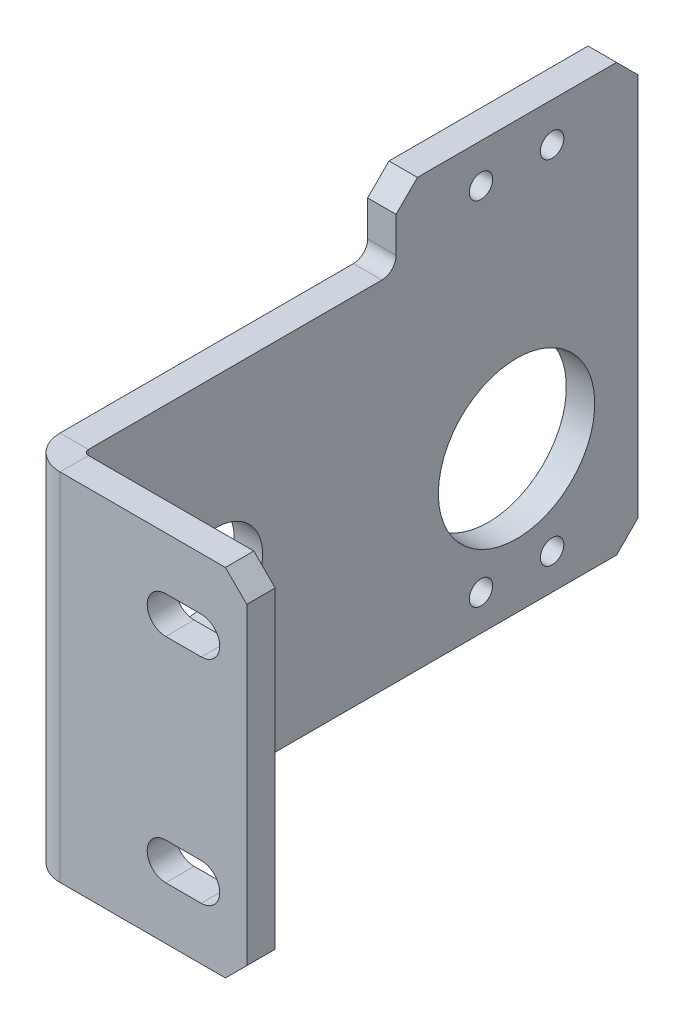
ISO-10303-21;
HEADER;
FILE_DESCRIPTION(('STEP AP214'),'2;1');
FILE_NAME('part.step','',(''),(''),'','','');
FILE_SCHEMA(('AUTOMOTIVE_DESIGN { 1 0 10303 214 1 1 1 1 }'));
ENDSEC;
DATA;
#1=APPLICATION_CONTEXT('core data for automotive mechanical design processes');
#2=APPLICATION_PROTOCOL_DEFINITION('international standard','automotive_design',2000,#1);
#3=PRODUCT_CONTEXT('',#1,'mechanical');
#4=PRODUCT('Part','Part','',(#3));
#5=PRODUCT_RELATED_PRODUCT_CATEGORY('part','',(#4));
#6=PRODUCT_DEFINITION_FORMATION('','',#4);
#7=PRODUCT_DEFINITION_CONTEXT('part definition',#1,'design');
#8=PRODUCT_DEFINITION('design','',#6,#7);
#9=PRODUCT_DEFINITION_SHAPE('','',#8);
#10=(LENGTH_UNIT() NAMED_UNIT(*) SI_UNIT(.MILLI.,.METRE.));
#11=(NAMED_UNIT(*) PLANE_ANGLE_UNIT() SI_UNIT($,.RADIAN.));
#12=(NAMED_UNIT(*) SI_UNIT($,.STERADIAN.) SOLID_ANGLE_UNIT());
#13=UNCERTAINTY_MEASURE_WITH_UNIT(LENGTH_MEASURE(1.E-05),#10,'distance_accuracy_value','');
#14=(GEOMETRIC_REPRESENTATION_CONTEXT(3) GLOBAL_UNCERTAINTY_ASSIGNED_CONTEXT((#13)) GLOBAL_UNIT_ASSIGNED_CONTEXT((#10,
#11,#12)) REPRESENTATION_CONTEXT('',''));
#15=CARTESIAN_POINT('',(0.,0.,0.));
#16=DIRECTION('',(0.,0.,1.));
#17=DIRECTION('',(1.,0.,0.));
#18=AXIS2_PLACEMENT_3D('',#15,#16,#17);
#19=CARTESIAN_POINT('',(4.7366,50.,-4.));
#20=DIRECTION('',(0.,1.,0.));
#21=DIRECTION('',(0.,0.,1.));
#22=AXIS2_PLACEMENT_3D('',#19,#20,#21);
#23=PLANE('',#22);
#24=DIRECTION('',(0.,0.,-1.));
#25=VECTOR('',#24,1.);
#26=CARTESIAN_POINT('',(4.,50.,0.));
#27=LINE('',#26,#25);
#28=CARTESIAN_POINT('',(4.,50.,-4.7366));
#29=VERTEX_POINT('',#28);
#30=CARTESIAN_POINT('',(4.,50.,-46.));
#31=VERTEX_POINT('',#30);
#32=EDGE_CURVE('E281',#29,#31,#27,.T.);
#33=ORIENTED_EDGE('',*,*,#32,.T.);
#34=DIRECTION('',(1.,0.,0.));
#35=VECTOR('',#34,1.);
#36=CARTESIAN_POINT('',(4.7366,50.,-46.));
#37=LINE('',#36,#35);
#38=CARTESIAN_POINT('',(0.,50.,-46.));
#39=VERTEX_POINT('',#38);
#40=EDGE_CURVE('E56',#31,#39,#37,.F.);
#41=ORIENTED_EDGE('',*,*,#40,.T.);
#42=DIRECTION('',(0.,0.,-1.));
#43=VECTOR('',#42,1.);
#44=CARTESIAN_POINT('',(0.,50.,0.));
#45=LINE('',#44,#43);
#46=CARTESIAN_POINT('',(0.,50.,-4.7366));
#47=VERTEX_POINT('',#46);
#48=EDGE_CURVE('E283',#47,#39,#45,.T.);
#49=ORIENTED_EDGE('',*,*,#48,.F.);
#50=DIRECTION('',(1.,0.,0.));
#51=VECTOR('',#50,1.);
#52=CARTESIAN_POINT('',(0.,50.,-4.7366));
#53=LINE('',#52,#51);
#54=EDGE_CURVE('E342',#47,#29,#53,.T.);
#55=ORIENTED_EDGE('',*,*,#54,.T.);
#56=EDGE_LOOP('',(#33,#41,#49,#55));
#57=FACE_BOUND('',#56,.T.);
#58=ADVANCED_FACE('F41',(#57),#23,.T.);
#59=CARTESIAN_POINT('',(0.,50.,-4.7366));
#60=DIRECTION('',(0.,1.,0.));
#61=DIRECTION('',(0.,0.,1.));
#62=AXIS2_PLACEMENT_3D('',#59,#60,#61);
#63=PLANE('',#62);
#64=ORIENTED_EDGE('',*,*,#54,.F.);
#65=CARTESIAN_POINT('',(4.7366,50.,-4.7366));
#66=DIRECTION('',(0.,1.,0.));
#67=DIRECTION('',(0.,0.,1.));
#68=AXIS2_PLACEMENT_3D('',#65,#66,#67);
#69=CIRCLE('',#68,4.7366);
#70=CARTESIAN_POINT('',(4.7366,50.,0.));
#71=VERTEX_POINT('',#70);
#72=EDGE_CURVE('E286',#71,#47,#69,.F.);
#73=ORIENTED_EDGE('',*,*,#72,.F.);
#74=DIRECTION('',(0.,0.,1.));
#75=VECTOR('',#74,1.);
#76=CARTESIAN_POINT('',(4.7366,50.,-4.));
#77=LINE('',#76,#75);
#78=CARTESIAN_POINT('',(4.7366,50.,-4.));
#79=VERTEX_POINT('',#78);
#80=EDGE_CURVE('E339',#79,#71,#77,.T.);
#81=ORIENTED_EDGE('',*,*,#80,.F.);
#82=CARTESIAN_POINT('',(4.7366,50.,-4.7366));
#83=DIRECTION('',(0.,1.,0.));
#84=DIRECTION('',(1.,0.,0.));
#85=AXIS2_PLACEMENT_3D('',#82,#83,#84);
#86=CIRCLE('',#85,0.7366);
#87=EDGE_CURVE('E293',#79,#29,#86,.F.);
#88=ORIENTED_EDGE('',*,*,#87,.T.);
#89=EDGE_LOOP('',(#64,#73,#81,#88));
#90=FACE_BOUND('',#89,.T.);
#91=ADVANCED_FACE('F446',(#90),#63,.T.);
#92=CARTESIAN_POINT('',(4.7366,0.,0.));
#93=DIRECTION('',(0.,-1.,0.));
#94=DIRECTION('',(0.,0.,-1.));
#95=AXIS2_PLACEMENT_3D('',#92,#93,#94);
#96=PLANE('',#95);
#97=DIRECTION('',(0.,0.,-1.));
#98=VECTOR('',#97,1.);
#99=CARTESIAN_POINT('',(4.7366,0.,0.));
#100=LINE('',#99,#98);
#101=CARTESIAN_POINT('',(4.7366,0.,0.));
#102=VERTEX_POINT('',#101);
#103=CARTESIAN_POINT('',(4.7366,0.,-4.));
#104=VERTEX_POINT('',#103);
#105=EDGE_CURVE('E336',#102,#104,#100,.T.);
#106=ORIENTED_EDGE('',*,*,#105,.F.);
#107=CARTESIAN_POINT('',(4.7366,0.,-4.7366));
#108=DIRECTION('',(0.,1.,0.));
#109=DIRECTION('',(0.,0.,1.));
#110=AXIS2_PLACEMENT_3D('',#107,#108,#109);
#111=CIRCLE('',#110,4.7366);
#112=CARTESIAN_POINT('',(0.,0.,-4.7366));
#113=VERTEX_POINT('',#112);
#114=EDGE_CURVE('E302',#102,#113,#111,.F.);
#115=ORIENTED_EDGE('',*,*,#114,.T.);
#116=DIRECTION('',(-1.,0.,0.));
#117=VECTOR('',#116,1.);
#118=CARTESIAN_POINT('',(4.,0.,-4.7366));
#119=LINE('',#118,#117);
#120=CARTESIAN_POINT('',(4.,0.,-4.7366));
#121=VERTEX_POINT('',#120);
#122=EDGE_CURVE('E334',#121,#113,#119,.T.);
#123=ORIENTED_EDGE('',*,*,#122,.F.);
#124=CARTESIAN_POINT('',(4.7366,0.,-4.7366));
#125=DIRECTION('',(0.,1.,0.));
#126=DIRECTION('',(1.,0.,0.));
#127=AXIS2_PLACEMENT_3D('',#124,#125,#126);
#128=CIRCLE('',#127,0.7366);
#129=EDGE_CURVE('E284',#104,#121,#128,.F.);
#130=ORIENTED_EDGE('',*,*,#129,.F.);
#131=EDGE_LOOP('',(#106,#115,#123,#130));
#132=FACE_BOUND('',#131,.T.);
#133=ADVANCED_FACE('F451',(#132),#96,.T.);
#134=CARTESIAN_POINT('',(4.,0.,-4.7366));
#135=DIRECTION('',(0.,-1.,0.));
#136=DIRECTION('',(0.,0.,-1.));
#137=AXIS2_PLACEMENT_3D('',#134,#135,#136);
#138=PLANE('',#137);
#139=DIRECTION('',(1.,0.,0.));
#140=VECTOR('',#139,1.);
#141=CARTESIAN_POINT('',(0.,0.,-4.));
#142=LINE('',#141,#140);
#143=CARTESIAN_POINT('',(28.,0.,-4.));
#144=VERTEX_POINT('',#143);
#145=EDGE_CURVE('E307',#144,#104,#142,.F.);
#146=ORIENTED_EDGE('',*,*,#145,.F.);
#147=DIRECTION('',(0.,0.,1.));
#148=VECTOR('',#147,1.);
#149=CARTESIAN_POINT('',(28.,0.,-4.7366));
#150=LINE('',#149,#148);
#151=CARTESIAN_POINT('',(28.,0.,0.));
#152=VERTEX_POINT('',#151);
#153=EDGE_CURVE('E371',#144,#152,#150,.T.);
#154=ORIENTED_EDGE('',*,*,#153,.T.);
#155=DIRECTION('',(-1.,0.,0.));
#156=VECTOR('',#155,1.);
#157=CARTESIAN_POINT('',(0.,0.,0.));
#158=LINE('',#157,#156);
#159=EDGE_CURVE('E305',#152,#102,#158,.T.);
#160=ORIENTED_EDGE('',*,*,#159,.T.);
#161=ORIENTED_EDGE('',*,*,#105,.T.);
#162=EDGE_LOOP('',(#146,#154,#160,#161));
#163=FACE_BOUND('',#162,.T.);
#164=ADVANCED_FACE('F511',(#163),#138,.T.);
#165=CARTESIAN_POINT('',(4.,50.,0.));
#166=DIRECTION('',(-1.,0.,0.));
#167=DIRECTION('',(0.,0.,1.));
#168=AXIS2_PLACEMENT_3D('',#165,#166,#167);
#169=PLANE('',#168);
#170=CARTESIAN_POINT('',(4.,5.,-59.9414575403353));
#171=DIRECTION('',(-1.,0.,0.));
#172=DIRECTION('',(0.,0.,1.));
#173=AXIS2_PLACEMENT_3D('',#170,#171,#172);
#174=CIRCLE('',#173,1.64999999999999);
#175=CARTESIAN_POINT('',(4.,5.,-58.2914575403353));
#176=VERTEX_POINT('',#175);
#177=EDGE_CURVE('E924',#176,#176,#174,.T.);
#178=ORIENTED_EDGE('',*,*,#177,.T.);
#179=EDGE_LOOP('',(#178));
#180=FACE_BOUND('',#179,.T.);
#181=CARTESIAN_POINT('',(4.,5.,-69.9414575403353));
#182=DIRECTION('',(-1.,0.,0.));
#183=DIRECTION('',(0.,0.,1.));
#184=AXIS2_PLACEMENT_3D('',#181,#182,#183);
#185=CIRCLE('',#184,1.64999999999999);
#186=CARTESIAN_POINT('',(4.,5.,-68.2914575403353));
#187=VERTEX_POINT('',#186);
#188=EDGE_CURVE('E928',#187,#187,#185,.T.);
#189=ORIENTED_EDGE('',*,*,#188,.T.);
#190=EDGE_LOOP('',(#189));
#191=FACE_BOUND('',#190,.T.);
#192=CARTESIAN_POINT('',(4.,54.5,-69.9414575403353));
#193=DIRECTION('',(-1.,0.,0.));
#194=DIRECTION('',(0.,0.,1.));
#195=AXIS2_PLACEMENT_3D('',#192,#193,#194);
#196=CIRCLE('',#195,1.64999999999999);
#197=CARTESIAN_POINT('',(4.,54.5,-68.2914575403353));
#198=VERTEX_POINT('',#197);
#199=EDGE_CURVE('E937',#198,#198,#196,.T.);
#200=ORIENTED_EDGE('',*,*,#199,.T.);
#201=EDGE_LOOP('',(#200));
#202=FACE_BOUND('',#201,.T.);
#203=CARTESIAN_POINT('',(4.,54.5,-59.9414575403353));
#204=DIRECTION('',(-1.,0.,0.));
#205=DIRECTION('',(0.,0.,1.));
#206=AXIS2_PLACEMENT_3D('',#203,#204,#205);
#207=CIRCLE('',#206,1.64999999999999);
#208=CARTESIAN_POINT('',(4.,54.5,-58.2914575403353));
#209=VERTEX_POINT('',#208);
#210=EDGE_CURVE('E943',#209,#209,#207,.T.);
#211=ORIENTED_EDGE('',*,*,#210,.T.);
#212=EDGE_LOOP('',(#211));
#213=FACE_BOUND('',#212,.T.);
#214=CARTESIAN_POINT('',(4.,20.,-64.9414575403353));
#215=DIRECTION('',(-1.,0.,0.));
#216=DIRECTION('',(0.,0.,1.));
#217=AXIS2_PLACEMENT_3D('',#214,#215,#216);
#218=CIRCLE('',#217,11.);
#219=CARTESIAN_POINT('',(4.,20.,-53.9414575403353));
#220=VERTEX_POINT('',#219);
#221=EDGE_CURVE('E271',#220,#220,#218,.T.);
#222=ORIENTED_EDGE('',*,*,#221,.T.);
#223=EDGE_LOOP('',(#222));
#224=FACE_BOUND('',#223,.T.);
#225=CARTESIAN_POINT('',(4.,25.,-22.7366));
#226=DIRECTION('',(-1.,0.,0.));
#227=DIRECTION('',(0.,0.,1.));
#228=AXIS2_PLACEMENT_3D('',#225,#226,#227);
#229=CIRCLE('',#228,6.50000000000001);
#230=CARTESIAN_POINT('',(4.,25.,-16.2366));
#231=VERTEX_POINT('',#230);
#232=EDGE_CURVE('E277',#231,#231,#229,.T.);
#233=ORIENTED_EDGE('',*,*,#232,.T.);
#234=EDGE_LOOP('',(#233));
#235=FACE_BOUND('',#234,.T.);
#236=DIRECTION('',(0.,0.,-1.));
#237=VECTOR('',#236,1.);
#238=CARTESIAN_POINT('',(4.,0.,0.));
#239=LINE('',#238,#237);
#240=CARTESIAN_POINT('',(4.,0.,-79.));
#241=VERTEX_POINT('',#240);
#242=EDGE_CURVE('E280',#121,#241,#239,.T.);
#243=ORIENTED_EDGE('',*,*,#242,.T.);
#244=DIRECTION('',(0.,0.707106781186551,-0.707106781186544));
#245=VECTOR('',#244,1.);
#246=CARTESIAN_POINT('',(4.,0.,-79.));
#247=LINE('',#246,#245);
#248=CARTESIAN_POINT('',(4.,2.99999999999999,-82.));
#249=VERTEX_POINT('',#248);
#250=EDGE_CURVE('E351',#241,#249,#247,.T.);
#251=ORIENTED_EDGE('',*,*,#250,.T.);
#252=DIRECTION('',(0.,-1.,0.));
#253=VECTOR('',#252,1.);
#254=CARTESIAN_POINT('',(4.,50.,-82.));
#255=LINE('',#254,#253);
#256=CARTESIAN_POINT('',(4.,57.,-82.));
#257=VERTEX_POINT('',#256);
#258=EDGE_CURVE('E331',#257,#249,#255,.T.);
#259=ORIENTED_EDGE('',*,*,#258,.F.);
#260=DIRECTION('',(0.,-0.707106781186549,-0.707106781186546));
#261=VECTOR('',#260,1.);
#262=CARTESIAN_POINT('',(4.,60.,-79.));
#263=LINE('',#262,#261);
#264=CARTESIAN_POINT('',(4.,60.,-79.));
#265=VERTEX_POINT('',#264);
#266=EDGE_CURVE('E349',#257,#265,#263,.F.);
#267=ORIENTED_EDGE('',*,*,#266,.T.);
#268=DIRECTION('',(0.,0.,-1.));
#269=VECTOR('',#268,1.);
#270=CARTESIAN_POINT('',(4.,60.,-82.));
#271=LINE('',#270,#269);
#272=CARTESIAN_POINT('',(4.,60.,-51.));
#273=VERTEX_POINT('',#272);
#274=EDGE_CURVE('E260',#273,#265,#271,.T.);
#275=ORIENTED_EDGE('',*,*,#274,.F.);
#276=DIRECTION('',(0.,-0.707106781186549,0.707106781186546));
#277=VECTOR('',#276,1.);
#278=CARTESIAN_POINT('',(4.,60.,-51.));
#279=LINE('',#278,#277);
#280=CARTESIAN_POINT('',(4.,57.,-48.));
#281=VERTEX_POINT('',#280);
#282=EDGE_CURVE('E347',#273,#281,#279,.T.);
#283=ORIENTED_EDGE('',*,*,#282,.T.);
#284=DIRECTION('',(0.,-1.,0.));
#285=VECTOR('',#284,1.);
#286=CARTESIAN_POINT('',(4.,60.,-48.));
#287=LINE('',#286,#285);
#288=CARTESIAN_POINT('',(4.,52.,-48.));
#289=VERTEX_POINT('',#288);
#290=EDGE_CURVE('E263',#281,#289,#287,.T.);
#291=ORIENTED_EDGE('',*,*,#290,.T.);
#292=CARTESIAN_POINT('',(4.,52.,-46.));
#293=DIRECTION('',(-1.,0.,0.));
#294=DIRECTION('',(0.,0.,1.));
#295=AXIS2_PLACEMENT_3D('',#292,#293,#294);
#296=CIRCLE('',#295,2.);
#297=EDGE_CURVE('E49',#289,#31,#296,.T.);
#298=ORIENTED_EDGE('',*,*,#297,.T.);
#299=ORIENTED_EDGE('',*,*,#32,.F.);
#300=DIRECTION('',(0.,-1.,0.));
#301=VECTOR('',#300,1.);
#302=CARTESIAN_POINT('',(4.,50.,-4.7366));
#303=LINE('',#302,#301);
#304=EDGE_CURVE('E296',#29,#121,#303,.T.);
#305=ORIENTED_EDGE('',*,*,#304,.T.);
#306=EDGE_LOOP('',(#243,#251,#259,#267,#275,#283,#291,#298,#299,#305));
#307=FACE_BOUND('',#306,.T.);
#308=ADVANCED_FACE('F421',(#180,#191,#202,#213,#224,#235,#307),#169,.F.);
#309=CARTESIAN_POINT('',(0.,50.,-82.));
#310=DIRECTION('',(0.,0.,-1.));
#311=DIRECTION('',(-1.,0.,0.));
#312=AXIS2_PLACEMENT_3D('',#309,#310,#311);
#313=PLANE('',#312);
#314=ORIENTED_EDGE('',*,*,#258,.T.);
#315=DIRECTION('',(-1.,0.,0.));
#316=VECTOR('',#315,1.);
#317=CARTESIAN_POINT('',(0.,2.99999999999999,-82.));
#318=LINE('',#317,#316);
#319=CARTESIAN_POINT('',(0.,2.99999999999999,-82.));
#320=VERTEX_POINT('',#319);
#321=EDGE_CURVE('E355',#249,#320,#318,.T.);
#322=ORIENTED_EDGE('',*,*,#321,.T.);
#323=DIRECTION('',(0.,-1.,0.));
#324=VECTOR('',#323,1.);
#325=CARTESIAN_POINT('',(0.,50.,-82.));
#326=LINE('',#325,#324);
#327=CARTESIAN_POINT('',(0.,57.,-82.));
#328=VERTEX_POINT('',#327);
#329=EDGE_CURVE('E328',#328,#320,#326,.T.);
#330=ORIENTED_EDGE('',*,*,#329,.F.);
#331=DIRECTION('',(1.,0.,0.));
#332=VECTOR('',#331,1.);
#333=CARTESIAN_POINT('',(0.,57.,-82.));
#334=LINE('',#333,#332);
#335=EDGE_CURVE('E353',#328,#257,#334,.T.);
#336=ORIENTED_EDGE('',*,*,#335,.T.);
#337=EDGE_LOOP('',(#314,#322,#330,#336));
#338=FACE_BOUND('',#337,.T.);
#339=ADVANCED_FACE('F550',(#338),#313,.T.);
#340=CARTESIAN_POINT('',(0.,50.,0.));
#341=DIRECTION('',(-1.,0.,0.));
#342=DIRECTION('',(0.,0.,1.));
#343=AXIS2_PLACEMENT_3D('',#340,#341,#342);
#344=PLANE('',#343);
#345=CARTESIAN_POINT('',(0.,5.,-59.9414575403353));
#346=DIRECTION('',(-1.,0.,0.));
#347=DIRECTION('',(0.,0.,1.));
#348=AXIS2_PLACEMENT_3D('',#345,#346,#347);
#349=CIRCLE('',#348,1.64999999999999);
#350=CARTESIAN_POINT('',(0.,5.,-58.2914575403353));
#351=VERTEX_POINT('',#350);
#352=EDGE_CURVE('E921',#351,#351,#349,.T.);
#353=ORIENTED_EDGE('',*,*,#352,.F.);
#354=EDGE_LOOP('',(#353));
#355=FACE_BOUND('',#354,.T.);
#356=CARTESIAN_POINT('',(0.,5.,-69.9414575403353));
#357=DIRECTION('',(-1.,0.,0.));
#358=DIRECTION('',(0.,0.,1.));
#359=AXIS2_PLACEMENT_3D('',#356,#357,#358);
#360=CIRCLE('',#359,1.64999999999999);
#361=CARTESIAN_POINT('',(0.,5.,-68.2914575403353));
#362=VERTEX_POINT('',#361);
#363=EDGE_CURVE('E925',#362,#362,#360,.T.);
#364=ORIENTED_EDGE('',*,*,#363,.F.);
#365=EDGE_LOOP('',(#364));
#366=FACE_BOUND('',#365,.T.);
#367=CARTESIAN_POINT('',(0.,54.5,-69.9414575403353));
#368=DIRECTION('',(-1.,0.,0.));
#369=DIRECTION('',(0.,0.,1.));
#370=AXIS2_PLACEMENT_3D('',#367,#368,#369);
#371=CIRCLE('',#370,1.64999999999998);
#372=CARTESIAN_POINT('',(0.,54.5,-68.2914575403353));
#373=VERTEX_POINT('',#372);
#374=EDGE_CURVE('E934',#373,#373,#371,.T.);
#375=ORIENTED_EDGE('',*,*,#374,.F.);
#376=EDGE_LOOP('',(#375));
#377=FACE_BOUND('',#376,.T.);
#378=CARTESIAN_POINT('',(0.,54.5,-59.9414575403353));
#379=DIRECTION('',(-1.,0.,0.));
#380=DIRECTION('',(0.,0.,1.));
#381=AXIS2_PLACEMENT_3D('',#378,#379,#380);
#382=CIRCLE('',#381,1.64999999999998);
#383=CARTESIAN_POINT('',(0.,54.5,-58.2914575403353));
#384=VERTEX_POINT('',#383);
#385=EDGE_CURVE('E940',#384,#384,#382,.T.);
#386=ORIENTED_EDGE('',*,*,#385,.F.);
#387=EDGE_LOOP('',(#386));
#388=FACE_BOUND('',#387,.T.);
#389=CARTESIAN_POINT('',(0.,20.,-64.9414575403353));
#390=DIRECTION('',(-1.,0.,0.));
#391=DIRECTION('',(0.,0.,1.));
#392=AXIS2_PLACEMENT_3D('',#389,#390,#391);
#393=CIRCLE('',#392,11.);
#394=CARTESIAN_POINT('',(0.,20.,-53.9414575403353));
#395=VERTEX_POINT('',#394);
#396=EDGE_CURVE('E268',#395,#395,#393,.T.);
#397=ORIENTED_EDGE('',*,*,#396,.F.);
#398=EDGE_LOOP('',(#397));
#399=FACE_BOUND('',#398,.T.);
#400=CARTESIAN_POINT('',(0.,25.,-22.7366));
#401=DIRECTION('',(-1.,0.,0.));
#402=DIRECTION('',(0.,0.,1.));
#403=AXIS2_PLACEMENT_3D('',#400,#401,#402);
#404=CIRCLE('',#403,6.50000000000001);
#405=CARTESIAN_POINT('',(0.,25.,-16.2366));
#406=VERTEX_POINT('',#405);
#407=EDGE_CURVE('E274',#406,#406,#404,.T.);
#408=ORIENTED_EDGE('',*,*,#407,.F.);
#409=EDGE_LOOP('',(#408));
#410=FACE_BOUND('',#409,.T.);
#411=ORIENTED_EDGE('',*,*,#329,.T.);
#412=DIRECTION('',(0.,-0.707106781186551,0.707106781186544));
#413=VECTOR('',#412,1.);
#414=CARTESIAN_POINT('',(0.,-14.4999999999998,-64.5000000000004));
#415=LINE('',#414,#413);
#416=CARTESIAN_POINT('',(0.,0.,-79.));
#417=VERTEX_POINT('',#416);
#418=EDGE_CURVE('E361',#320,#417,#415,.T.);
#419=ORIENTED_EDGE('',*,*,#418,.T.);
#420=DIRECTION('',(0.,0.,-1.));
#421=VECTOR('',#420,1.);
#422=CARTESIAN_POINT('',(0.,0.,0.));
#423=LINE('',#422,#421);
#424=EDGE_CURVE('E299',#113,#417,#423,.T.);
#425=ORIENTED_EDGE('',*,*,#424,.F.);
#426=DIRECTION('',(0.,-1.,0.));
#427=VECTOR('',#426,1.);
#428=CARTESIAN_POINT('',(0.,50.,-4.7366));
#429=LINE('',#428,#427);
#430=EDGE_CURVE('E325',#47,#113,#429,.T.);
#431=ORIENTED_EDGE('',*,*,#430,.F.);
#432=ORIENTED_EDGE('',*,*,#48,.T.);
#433=CARTESIAN_POINT('',(0.,52.,-46.));
#434=DIRECTION('',(-1.,0.,0.));
#435=DIRECTION('',(0.,0.,1.));
#436=AXIS2_PLACEMENT_3D('',#433,#434,#435);
#437=CIRCLE('',#436,2.);
#438=CARTESIAN_POINT('',(0.,52.,-48.));
#439=VERTEX_POINT('',#438);
#440=EDGE_CURVE('E11',#39,#439,#437,.F.);
#441=ORIENTED_EDGE('',*,*,#440,.T.);
#442=DIRECTION('',(0.,-1.,0.));
#443=VECTOR('',#442,1.);
#444=CARTESIAN_POINT('',(0.,60.,-48.));
#445=LINE('',#444,#443);
#446=CARTESIAN_POINT('',(0.,57.,-48.));
#447=VERTEX_POINT('',#446);
#448=EDGE_CURVE('E265',#447,#439,#445,.T.);
#449=ORIENTED_EDGE('',*,*,#448,.F.);
#450=DIRECTION('',(0.,0.707106781186549,-0.707106781186546));
#451=VECTOR('',#450,1.);
#452=CARTESIAN_POINT('',(0.,29.5,-20.5000000000001));
#453=LINE('',#452,#451);
#454=CARTESIAN_POINT('',(0.,60.,-51.));
#455=VERTEX_POINT('',#454);
#456=EDGE_CURVE('E357',#447,#455,#453,.T.);
#457=ORIENTED_EDGE('',*,*,#456,.T.);
#458=DIRECTION('',(0.,0.,1.));
#459=VECTOR('',#458,1.);
#460=CARTESIAN_POINT('',(0.,60.,-82.));
#461=LINE('',#460,#459);
#462=CARTESIAN_POINT('',(0.,60.,-79.));
#463=VERTEX_POINT('',#462);
#464=EDGE_CURVE('E251',#463,#455,#461,.T.);
#465=ORIENTED_EDGE('',*,*,#464,.F.);
#466=DIRECTION('',(0.,0.707106781186549,0.707106781186546));
#467=VECTOR('',#466,1.);
#468=CARTESIAN_POINT('',(0.,94.5,-44.5000000000002));
#469=LINE('',#468,#467);
#470=EDGE_CURVE('E359',#463,#328,#469,.F.);
#471=ORIENTED_EDGE('',*,*,#470,.T.);
#472=EDGE_LOOP('',(#411,#419,#425,#431,#432,#441,#449,#457,#465,#471));
#473=FACE_BOUND('',#472,.T.);
#474=ADVANCED_FACE('F432',(#355,#366,#377,#388,#399,#410,#473),#344,.T.);
#475=CARTESIAN_POINT('',(4.7366,50.,-4.7366));
#476=DIRECTION('',(0.,-1.,0.));
#477=DIRECTION('',(0.,0.,-1.));
#478=AXIS2_PLACEMENT_3D('',#475,#476,#477);
#479=CYLINDRICAL_SURFACE('',#478,4.7366);
#480=ORIENTED_EDGE('',*,*,#114,.F.);
#481=DIRECTION('',(0.,-1.,0.));
#482=VECTOR('',#481,1.);
#483=CARTESIAN_POINT('',(4.7366,50.,0.));
#484=LINE('',#483,#482);
#485=EDGE_CURVE('E322',#71,#102,#484,.T.);
#486=ORIENTED_EDGE('',*,*,#485,.F.);
#487=ORIENTED_EDGE('',*,*,#72,.T.);
#488=ORIENTED_EDGE('',*,*,#430,.T.);
#489=EDGE_LOOP('',(#480,#486,#487,#488));
#490=FACE_BOUND('',#489,.T.);
#491=ADVANCED_FACE('F527',(#490),#479,.T.);
#492=CARTESIAN_POINT('',(0.,50.,0.));
#493=DIRECTION('',(0.,0.,1.));
#494=DIRECTION('',(1.,0.,0.));
#495=AXIS2_PLACEMENT_3D('',#492,#493,#494);
#496=PLANE('',#495);
#497=CARTESIAN_POINT('',(19.6,10.,0.));
#498=DIRECTION('',(0.,0.,1.));
#499=DIRECTION('',(1.,0.,0.));
#500=AXIS2_PLACEMENT_3D('',#497,#498,#499);
#501=CIRCLE('',#500,2.6);
#502=CARTESIAN_POINT('',(19.6,12.6,0.));
#503=VERTEX_POINT('',#502);
#504=CARTESIAN_POINT('',(19.6,7.4,0.));
#505=VERTEX_POINT('',#504);
#506=EDGE_CURVE('E223',#503,#505,#501,.T.);
#507=ORIENTED_EDGE('',*,*,#506,.F.);
#508=DIRECTION('',(-1.,0.,0.));
#509=VECTOR('',#508,1.);
#510=CARTESIAN_POINT('',(19.6,12.6,0.));
#511=LINE('',#510,#509);
#512=CARTESIAN_POINT('',(24.6,12.6,0.));
#513=VERTEX_POINT('',#512);
#514=EDGE_CURVE('E228',#513,#503,#511,.T.);
#515=ORIENTED_EDGE('',*,*,#514,.F.);
#516=CARTESIAN_POINT('',(24.6,10.,0.));
#517=DIRECTION('',(0.,0.,1.));
#518=DIRECTION('',(1.,0.,0.));
#519=AXIS2_PLACEMENT_3D('',#516,#517,#518);
#520=CIRCLE('',#519,2.6);
#521=CARTESIAN_POINT('',(24.6,7.4,0.));
#522=VERTEX_POINT('',#521);
#523=EDGE_CURVE('E207',#522,#513,#520,.T.);
#524=ORIENTED_EDGE('',*,*,#523,.F.);
#525=DIRECTION('',(1.,0.,0.));
#526=VECTOR('',#525,1.);
#527=CARTESIAN_POINT('',(24.6,7.4,0.));
#528=LINE('',#527,#526);
#529=EDGE_CURVE('E218',#505,#522,#528,.T.);
#530=ORIENTED_EDGE('',*,*,#529,.F.);
#531=EDGE_LOOP('',(#507,#515,#524,#530));
#532=FACE_BOUND('',#531,.T.);
#533=CARTESIAN_POINT('',(19.6,40.,0.));
#534=DIRECTION('',(0.,0.,1.));
#535=DIRECTION('',(1.,0.,0.));
#536=AXIS2_PLACEMENT_3D('',#533,#534,#535);
#537=CIRCLE('',#536,2.6);
#538=CARTESIAN_POINT('',(19.6,42.6,0.));
#539=VERTEX_POINT('',#538);
#540=CARTESIAN_POINT('',(19.6,37.4,0.));
#541=VERTEX_POINT('',#540);
#542=EDGE_CURVE('E235',#539,#541,#537,.T.);
#543=ORIENTED_EDGE('',*,*,#542,.F.);
#544=DIRECTION('',(-1.,0.,0.));
#545=VECTOR('',#544,1.);
#546=CARTESIAN_POINT('',(19.6,42.6,0.));
#547=LINE('',#546,#545);
#548=CARTESIAN_POINT('',(24.6,42.6,0.));
#549=VERTEX_POINT('',#548);
#550=EDGE_CURVE('E245',#549,#539,#547,.T.);
#551=ORIENTED_EDGE('',*,*,#550,.F.);
#552=CARTESIAN_POINT('',(24.6,40.,0.));
#553=DIRECTION('',(0.,0.,1.));
#554=DIRECTION('',(1.,0.,0.));
#555=AXIS2_PLACEMENT_3D('',#552,#553,#554);
#556=CIRCLE('',#555,2.6);
#557=CARTESIAN_POINT('',(24.6,37.4,0.));
#558=VERTEX_POINT('',#557);
#559=EDGE_CURVE('E242',#558,#549,#556,.T.);
#560=ORIENTED_EDGE('',*,*,#559,.F.);
#561=DIRECTION('',(1.,0.,0.));
#562=VECTOR('',#561,1.);
#563=CARTESIAN_POINT('',(24.6,37.4,0.));
#564=LINE('',#563,#562);
#565=EDGE_CURVE('E239',#541,#558,#564,.T.);
#566=ORIENTED_EDGE('',*,*,#565,.F.);
#567=EDGE_LOOP('',(#543,#551,#560,#566));
#568=FACE_BOUND('',#567,.T.);
#569=ORIENTED_EDGE('',*,*,#159,.F.);
#570=DIRECTION('',(-0.707106781186546,-0.707106781186549,0.));
#571=VECTOR('',#570,1.);
#572=CARTESIAN_POINT('',(39.0000000000001,11.0000000000001,0.));
#573=LINE('',#572,#571);
#574=CARTESIAN_POINT('',(31.,3.,0.));
#575=VERTEX_POINT('',#574);
#576=EDGE_CURVE('E376',#152,#575,#573,.F.);
#577=ORIENTED_EDGE('',*,*,#576,.T.);
#578=DIRECTION('',(0.,-1.,0.));
#579=VECTOR('',#578,1.);
#580=CARTESIAN_POINT('',(31.,50.,0.));
#581=LINE('',#580,#579);
#582=CARTESIAN_POINT('',(31.,47.,0.));
#583=VERTEX_POINT('',#582);
#584=EDGE_CURVE('E319',#583,#575,#581,.T.);
#585=ORIENTED_EDGE('',*,*,#584,.F.);
#586=DIRECTION('',(0.707106781186549,-0.707106781186546,0.));
#587=VECTOR('',#586,1.);
#588=CARTESIAN_POINT('',(13.9999999999999,64.,0.));
#589=LINE('',#588,#587);
#590=CARTESIAN_POINT('',(28.,50.,0.));
#591=VERTEX_POINT('',#590);
#592=EDGE_CURVE('E374',#583,#591,#589,.F.);
#593=ORIENTED_EDGE('',*,*,#592,.T.);
#594=DIRECTION('',(-1.,0.,0.));
#595=VECTOR('',#594,1.);
#596=CARTESIAN_POINT('',(0.,50.,0.));
#597=LINE('',#596,#595);
#598=EDGE_CURVE('E289',#591,#71,#597,.T.);
#599=ORIENTED_EDGE('',*,*,#598,.T.);
#600=ORIENTED_EDGE('',*,*,#485,.T.);
#601=EDGE_LOOP('',(#569,#577,#585,#593,#599,#600));
#602=FACE_BOUND('',#601,.T.);
#603=ADVANCED_FACE('F225',(#532,#568,#602),#496,.T.);
#604=CARTESIAN_POINT('',(31.,50.,-4.));
#605=DIRECTION('',(1.,0.,0.));
#606=DIRECTION('',(0.,0.,-1.));
#607=AXIS2_PLACEMENT_3D('',#604,#605,#606);
#608=PLANE('',#607);
#609=ORIENTED_EDGE('',*,*,#584,.T.);
#610=DIRECTION('',(0.,0.,-1.));
#611=VECTOR('',#610,1.);
#612=CARTESIAN_POINT('',(31.,3.,-4.));
#613=LINE('',#612,#611);
#614=CARTESIAN_POINT('',(31.,3.,-4.));
#615=VERTEX_POINT('',#614);
#616=EDGE_CURVE('E381',#575,#615,#613,.T.);
#617=ORIENTED_EDGE('',*,*,#616,.T.);
#618=DIRECTION('',(0.,-1.,0.));
#619=VECTOR('',#618,1.);
#620=CARTESIAN_POINT('',(31.,50.,-4.));
#621=LINE('',#620,#619);
#622=CARTESIAN_POINT('',(31.,47.,-4.));
#623=VERTEX_POINT('',#622);
#624=EDGE_CURVE('E316',#623,#615,#621,.T.);
#625=ORIENTED_EDGE('',*,*,#624,.F.);
#626=DIRECTION('',(0.,0.,1.));
#627=VECTOR('',#626,1.);
#628=CARTESIAN_POINT('',(31.,47.,-4.));
#629=LINE('',#628,#627);
#630=EDGE_CURVE('E378',#623,#583,#629,.T.);
#631=ORIENTED_EDGE('',*,*,#630,.T.);
#632=EDGE_LOOP('',(#609,#617,#625,#631));
#633=FACE_BOUND('',#632,.T.);
#634=ADVANCED_FACE('F505',(#633),#608,.T.);
#635=CARTESIAN_POINT('',(0.,50.,-4.));
#636=DIRECTION('',(0.,0.,1.));
#637=DIRECTION('',(1.,0.,0.));
#638=AXIS2_PLACEMENT_3D('',#635,#636,#637);
#639=PLANE('',#638);
#640=DIRECTION('',(-1.,0.,0.));
#641=VECTOR('',#640,1.);
#642=CARTESIAN_POINT('',(0.,12.6,-4.));
#643=LINE('',#642,#641);
#644=CARTESIAN_POINT('',(24.6,12.6,-4.));
#645=VERTEX_POINT('',#644);
#646=CARTESIAN_POINT('',(19.6,12.6,-4.));
#647=VERTEX_POINT('',#646);
#648=EDGE_CURVE('E404',#645,#647,#643,.T.);
#649=ORIENTED_EDGE('',*,*,#648,.T.);
#650=CARTESIAN_POINT('',(19.6,10.,-4.));
#651=DIRECTION('',(0.,0.,1.));
#652=DIRECTION('',(1.,0.,0.));
#653=AXIS2_PLACEMENT_3D('',#650,#651,#652);
#654=CIRCLE('',#653,2.6);
#655=CARTESIAN_POINT('',(19.6,7.4,-4.));
#656=VERTEX_POINT('',#655);
#657=EDGE_CURVE('E407',#647,#656,#654,.T.);
#658=ORIENTED_EDGE('',*,*,#657,.T.);
#659=DIRECTION('',(1.,0.,0.));
#660=VECTOR('',#659,1.);
#661=CARTESIAN_POINT('',(0.,7.4,-4.));
#662=LINE('',#661,#660);
#663=CARTESIAN_POINT('',(24.6,7.4,-4.));
#664=VERTEX_POINT('',#663);
#665=EDGE_CURVE('E401',#656,#664,#662,.T.);
#666=ORIENTED_EDGE('',*,*,#665,.T.);
#667=CARTESIAN_POINT('',(24.6,10.,-4.));
#668=DIRECTION('',(0.,0.,1.));
#669=DIRECTION('',(1.,0.,0.));
#670=AXIS2_PLACEMENT_3D('',#667,#668,#669);
#671=CIRCLE('',#670,2.6);
#672=EDGE_CURVE('E210',#664,#645,#671,.T.);
#673=ORIENTED_EDGE('',*,*,#672,.T.);
#674=EDGE_LOOP('',(#649,#658,#666,#673));
#675=FACE_BOUND('',#674,.T.);
#676=DIRECTION('',(-1.,0.,0.));
#677=VECTOR('',#676,1.);
#678=CARTESIAN_POINT('',(0.,42.6,-4.));
#679=LINE('',#678,#677);
#680=CARTESIAN_POINT('',(24.6,42.6,-4.));
#681=VERTEX_POINT('',#680);
#682=CARTESIAN_POINT('',(19.6,42.6,-4.));
#683=VERTEX_POINT('',#682);
#684=EDGE_CURVE('E395',#681,#683,#679,.T.);
#685=ORIENTED_EDGE('',*,*,#684,.T.);
#686=CARTESIAN_POINT('',(19.6,40.,-4.));
#687=DIRECTION('',(0.,0.,1.));
#688=DIRECTION('',(1.,0.,0.));
#689=AXIS2_PLACEMENT_3D('',#686,#687,#688);
#690=CIRCLE('',#689,2.6);
#691=CARTESIAN_POINT('',(19.6,37.4,-4.));
#692=VERTEX_POINT('',#691);
#693=EDGE_CURVE('E398',#683,#692,#690,.T.);
#694=ORIENTED_EDGE('',*,*,#693,.T.);
#695=DIRECTION('',(1.,0.,0.));
#696=VECTOR('',#695,1.);
#697=CARTESIAN_POINT('',(0.,37.4,-4.));
#698=LINE('',#697,#696);
#699=CARTESIAN_POINT('',(24.6,37.4,-4.));
#700=VERTEX_POINT('',#699);
#701=EDGE_CURVE('E389',#692,#700,#698,.T.);
#702=ORIENTED_EDGE('',*,*,#701,.T.);
#703=CARTESIAN_POINT('',(24.6,40.,-4.));
#704=DIRECTION('',(0.,0.,1.));
#705=DIRECTION('',(1.,0.,0.));
#706=AXIS2_PLACEMENT_3D('',#703,#704,#705);
#707=CIRCLE('',#706,2.6);
#708=EDGE_CURVE('E392',#700,#681,#707,.T.);
#709=ORIENTED_EDGE('',*,*,#708,.T.);
#710=EDGE_LOOP('',(#685,#694,#702,#709));
#711=FACE_BOUND('',#710,.T.);
#712=ORIENTED_EDGE('',*,*,#624,.T.);
#713=DIRECTION('',(0.707106781186546,0.707106781186549,0.));
#714=VECTOR('',#713,1.);
#715=CARTESIAN_POINT('',(28.,0.,-4.));
#716=LINE('',#715,#714);
#717=EDGE_CURVE('E385',#615,#144,#716,.F.);
#718=ORIENTED_EDGE('',*,*,#717,.T.);
#719=ORIENTED_EDGE('',*,*,#145,.T.);
#720=DIRECTION('',(0.,-1.,0.));
#721=VECTOR('',#720,1.);
#722=CARTESIAN_POINT('',(4.7366,50.,-4.));
#723=LINE('',#722,#721);
#724=EDGE_CURVE('E313',#79,#104,#723,.T.);
#725=ORIENTED_EDGE('',*,*,#724,.F.);
#726=DIRECTION('',(1.,0.,0.));
#727=VECTOR('',#726,1.);
#728=CARTESIAN_POINT('',(0.,50.,-4.));
#729=LINE('',#728,#727);
#730=CARTESIAN_POINT('',(28.,50.,-4.));
#731=VERTEX_POINT('',#730);
#732=EDGE_CURVE('E291',#731,#79,#729,.F.);
#733=ORIENTED_EDGE('',*,*,#732,.F.);
#734=DIRECTION('',(-0.707106781186549,0.707106781186546,0.));
#735=VECTOR('',#734,1.);
#736=CARTESIAN_POINT('',(31.,47.,-4.));
#737=LINE('',#736,#735);
#738=EDGE_CURVE('E383',#731,#623,#737,.F.);
#739=ORIENTED_EDGE('',*,*,#738,.T.);
#740=EDGE_LOOP('',(#712,#718,#719,#725,#733,#739));
#741=FACE_BOUND('',#740,.T.);
#742=ADVANCED_FACE('F501',(#675,#711,#741),#639,.F.);
#743=CARTESIAN_POINT('',(4.7366,50.,-4.7366));
#744=DIRECTION('',(0.,-1.,0.));
#745=DIRECTION('',(0.,0.,-1.));
#746=AXIS2_PLACEMENT_3D('',#743,#744,#745);
#747=CYLINDRICAL_SURFACE('',#746,0.7366);
#748=ORIENTED_EDGE('',*,*,#129,.T.);
#749=ORIENTED_EDGE('',*,*,#304,.F.);
#750=ORIENTED_EDGE('',*,*,#87,.F.);
#751=ORIENTED_EDGE('',*,*,#724,.T.);
#752=EDGE_LOOP('',(#748,#749,#750,#751));
#753=FACE_BOUND('',#752,.T.);
#754=ADVANCED_FACE('F518',(#753),#747,.F.);
#755=CARTESIAN_POINT('',(4.7366,50.,-4.7366));
#756=DIRECTION('',(0.,1.,0.));
#757=DIRECTION('',(1.,0.,0.));
#758=AXIS2_PLACEMENT_3D('',#755,#756,#757);
#759=PLANE('',#758);
#760=ORIENTED_EDGE('',*,*,#598,.F.);
#761=DIRECTION('',(0.,0.,-1.));
#762=VECTOR('',#761,1.);
#763=CARTESIAN_POINT('',(28.,50.,-4.7366));
#764=LINE('',#763,#762);
#765=EDGE_CURVE('E387',#591,#731,#764,.T.);
#766=ORIENTED_EDGE('',*,*,#765,.T.);
#767=ORIENTED_EDGE('',*,*,#732,.T.);
#768=ORIENTED_EDGE('',*,*,#80,.T.);
#769=EDGE_LOOP('',(#760,#766,#767,#768));
#770=FACE_BOUND('',#769,.T.);
#771=ADVANCED_FACE('F536',(#770),#759,.T.);
#772=CARTESIAN_POINT('',(4.7366,0.,-4.7366));
#773=DIRECTION('',(0.,1.,0.));
#774=DIRECTION('',(1.,0.,0.));
#775=AXIS2_PLACEMENT_3D('',#772,#773,#774);
#776=PLANE('',#775);
#777=ORIENTED_EDGE('',*,*,#424,.T.);
#778=DIRECTION('',(1.,0.,0.));
#779=VECTOR('',#778,1.);
#780=CARTESIAN_POINT('',(4.,0.,-79.));
#781=LINE('',#780,#779);
#782=EDGE_CURVE('E344',#417,#241,#781,.T.);
#783=ORIENTED_EDGE('',*,*,#782,.T.);
#784=ORIENTED_EDGE('',*,*,#242,.F.);
#785=ORIENTED_EDGE('',*,*,#122,.T.);
#786=EDGE_LOOP('',(#777,#783,#784,#785));
#787=FACE_BOUND('',#786,.T.);
#788=ADVANCED_FACE('F523',(#787),#776,.F.);
#789=CARTESIAN_POINT('',(31.,25.,-22.7366));
#790=DIRECTION('',(-1.,0.,0.));
#791=DIRECTION('',(0.,0.,1.));
#792=AXIS2_PLACEMENT_3D('',#789,#790,#791);
#793=CYLINDRICAL_SURFACE('',#792,6.50000000000001);
#794=ORIENTED_EDGE('',*,*,#407,.T.);
#795=EDGE_LOOP('',(#794));
#796=FACE_BOUND('',#795,.T.);
#797=ORIENTED_EDGE('',*,*,#232,.F.);
#798=EDGE_LOOP('',(#797));
#799=FACE_BOUND('',#798,.T.);
#800=ADVANCED_FACE('F671',(#796,#799),#793,.F.);
#801=CARTESIAN_POINT('',(31.,20.,-64.9414575403353));
#802=DIRECTION('',(-1.,0.,0.));
#803=DIRECTION('',(0.,0.,1.));
#804=AXIS2_PLACEMENT_3D('',#801,#802,#803);
#805=CYLINDRICAL_SURFACE('',#804,11.);
#806=ORIENTED_EDGE('',*,*,#396,.T.);
#807=EDGE_LOOP('',(#806));
#808=FACE_BOUND('',#807,.T.);
#809=ORIENTED_EDGE('',*,*,#221,.F.);
#810=EDGE_LOOP('',(#809));
#811=FACE_BOUND('',#810,.T.);
#812=ADVANCED_FACE('F680',(#808,#811),#805,.F.);
#813=CARTESIAN_POINT('',(0.,60.,-48.));
#814=DIRECTION('',(0.,0.,-1.));
#815=DIRECTION('',(-1.,0.,0.));
#816=AXIS2_PLACEMENT_3D('',#813,#814,#815);
#817=PLANE('',#816);
#818=ORIENTED_EDGE('',*,*,#448,.T.);
#819=DIRECTION('',(1.,0.,0.));
#820=VECTOR('',#819,1.);
#821=CARTESIAN_POINT('',(0.,52.,-48.));
#822=LINE('',#821,#820);
#823=EDGE_CURVE('E410',#439,#289,#822,.T.);
#824=ORIENTED_EDGE('',*,*,#823,.T.);
#825=ORIENTED_EDGE('',*,*,#290,.F.);
#826=DIRECTION('',(-1.,0.,0.));
#827=VECTOR('',#826,1.);
#828=CARTESIAN_POINT('',(0.,57.,-48.));
#829=LINE('',#828,#827);
#830=EDGE_CURVE('E369',#281,#447,#829,.T.);
#831=ORIENTED_EDGE('',*,*,#830,.T.);
#832=EDGE_LOOP('',(#818,#824,#825,#831));
#833=FACE_BOUND('',#832,.T.);
#834=ADVANCED_FACE('F416',(#833),#817,.F.);
#835=CARTESIAN_POINT('',(0.,60.,0.));
#836=DIRECTION('',(0.,1.,0.));
#837=DIRECTION('',(0.,0.,1.));
#838=AXIS2_PLACEMENT_3D('',#835,#836,#837);
#839=PLANE('',#838);
#840=ORIENTED_EDGE('',*,*,#274,.T.);
#841=DIRECTION('',(-1.,0.,0.));
#842=VECTOR('',#841,1.);
#843=CARTESIAN_POINT('',(0.,60.,-79.));
#844=LINE('',#843,#842);
#845=EDGE_CURVE('E366',#265,#463,#844,.T.);
#846=ORIENTED_EDGE('',*,*,#845,.T.);
#847=ORIENTED_EDGE('',*,*,#464,.T.);
#848=DIRECTION('',(1.,0.,0.));
#849=VECTOR('',#848,1.);
#850=CARTESIAN_POINT('',(4.,60.,-51.));
#851=LINE('',#850,#849);
#852=EDGE_CURVE('E363',#455,#273,#851,.T.);
#853=ORIENTED_EDGE('',*,*,#852,.T.);
#854=EDGE_LOOP('',(#840,#846,#847,#853));
#855=FACE_BOUND('',#854,.T.);
#856=ADVANCED_FACE('F428',(#855),#839,.T.);
#857=CARTESIAN_POINT('',(4.7366,0.,-79.));
#858=DIRECTION('',(0.,-0.707106781186544,-0.707106781186551));
#859=DIRECTION('',(-1.,0.,0.));
#860=AXIS2_PLACEMENT_3D('',#857,#858,#859);
#861=PLANE('',#860);
#862=ORIENTED_EDGE('',*,*,#418,.F.);
#863=ORIENTED_EDGE('',*,*,#321,.F.);
#864=ORIENTED_EDGE('',*,*,#250,.F.);
#865=ORIENTED_EDGE('',*,*,#782,.F.);
#866=EDGE_LOOP('',(#862,#863,#864,#865));
#867=FACE_BOUND('',#866,.T.);
#868=ADVANCED_FACE('F458',(#867),#861,.T.);
#869=CARTESIAN_POINT('',(0.,60.,-79.));
#870=DIRECTION('',(0.,-0.707106781186546,0.707106781186549));
#871=DIRECTION('',(-1.,0.,0.));
#872=AXIS2_PLACEMENT_3D('',#869,#870,#871);
#873=PLANE('',#872);
#874=ORIENTED_EDGE('',*,*,#266,.F.);
#875=ORIENTED_EDGE('',*,*,#335,.F.);
#876=ORIENTED_EDGE('',*,*,#470,.F.);
#877=ORIENTED_EDGE('',*,*,#845,.F.);
#878=EDGE_LOOP('',(#874,#875,#876,#877));
#879=FACE_BOUND('',#878,.T.);
#880=ADVANCED_FACE('F464',(#879),#873,.F.);
#881=CARTESIAN_POINT('',(0.,60.,-51.));
#882=DIRECTION('',(0.,0.707106781186546,0.707106781186549));
#883=DIRECTION('',(-1.,0.,0.));
#884=AXIS2_PLACEMENT_3D('',#881,#882,#883);
#885=PLANE('',#884);
#886=ORIENTED_EDGE('',*,*,#456,.F.);
#887=ORIENTED_EDGE('',*,*,#830,.F.);
#888=ORIENTED_EDGE('',*,*,#282,.F.);
#889=ORIENTED_EDGE('',*,*,#852,.F.);
#890=EDGE_LOOP('',(#886,#887,#888,#889));
#891=FACE_BOUND('',#890,.T.);
#892=ADVANCED_FACE('F426',(#891),#885,.T.);
#893=CARTESIAN_POINT('',(28.,0.,-4.7366));
#894=DIRECTION('',(-0.707106781186549,0.707106781186546,0.));
#895=DIRECTION('',(0.,0.,1.));
#896=AXIS2_PLACEMENT_3D('',#893,#894,#895);
#897=PLANE('',#896);
#898=ORIENTED_EDGE('',*,*,#717,.F.);
#899=ORIENTED_EDGE('',*,*,#616,.F.);
#900=ORIENTED_EDGE('',*,*,#576,.F.);
#901=ORIENTED_EDGE('',*,*,#153,.F.);
#902=EDGE_LOOP('',(#898,#899,#900,#901));
#903=FACE_BOUND('',#902,.T.);
#904=ADVANCED_FACE('F477',(#903),#897,.F.);
#905=CARTESIAN_POINT('',(31.,47.,-4.));
#906=DIRECTION('',(-0.707106781186546,-0.707106781186549,0.));
#907=DIRECTION('',(0.,0.,1.));
#908=AXIS2_PLACEMENT_3D('',#905,#906,#907);
#909=PLANE('',#908);
#910=ORIENTED_EDGE('',*,*,#738,.F.);
#911=ORIENTED_EDGE('',*,*,#765,.F.);
#912=ORIENTED_EDGE('',*,*,#592,.F.);
#913=ORIENTED_EDGE('',*,*,#630,.F.);
#914=EDGE_LOOP('',(#910,#911,#912,#913));
#915=FACE_BOUND('',#914,.T.);
#916=ADVANCED_FACE('F482',(#915),#909,.F.);
#917=CARTESIAN_POINT('',(19.6,40.,-82.));
#918=DIRECTION('',(0.,0.,1.));
#919=DIRECTION('',(1.,0.,0.));
#920=AXIS2_PLACEMENT_3D('',#917,#918,#919);
#921=CYLINDRICAL_SURFACE('',#920,2.6);
#922=DIRECTION('',(0.,0.,1.));
#923=VECTOR('',#922,1.);
#924=CARTESIAN_POINT('',(19.6,42.6,-82.));
#925=LINE('',#924,#923);
#926=EDGE_CURVE('E249',#683,#539,#925,.T.);
#927=ORIENTED_EDGE('',*,*,#926,.T.);
#928=ORIENTED_EDGE('',*,*,#542,.T.);
#929=DIRECTION('',(0.,0.,1.));
#930=VECTOR('',#929,1.);
#931=CARTESIAN_POINT('',(19.6,37.4,-82.));
#932=LINE('',#931,#930);
#933=EDGE_CURVE('E248',#692,#541,#932,.T.);
#934=ORIENTED_EDGE('',*,*,#933,.F.);
#935=ORIENTED_EDGE('',*,*,#693,.F.);
#936=EDGE_LOOP('',(#927,#928,#934,#935));
#937=FACE_BOUND('',#936,.T.);
#938=ADVANCED_FACE('F487',(#937),#921,.F.);
#939=CARTESIAN_POINT('',(19.6,42.6,-82.));
#940=DIRECTION('',(0.,1.,0.));
#941=DIRECTION('',(0.,0.,1.));
#942=AXIS2_PLACEMENT_3D('',#939,#940,#941);
#943=PLANE('',#942);
#944=DIRECTION('',(0.,0.,1.));
#945=VECTOR('',#944,1.);
#946=CARTESIAN_POINT('',(24.6,42.6,-82.));
#947=LINE('',#946,#945);
#948=EDGE_CURVE('E252',#681,#549,#947,.T.);
#949=ORIENTED_EDGE('',*,*,#948,.T.);
#950=ORIENTED_EDGE('',*,*,#550,.T.);
#951=ORIENTED_EDGE('',*,*,#926,.F.);
#952=ORIENTED_EDGE('',*,*,#684,.F.);
#953=EDGE_LOOP('',(#949,#950,#951,#952));
#954=FACE_BOUND('',#953,.T.);
#955=ADVANCED_FACE('F492',(#954),#943,.F.);
#956=CARTESIAN_POINT('',(24.6,40.,-82.));
#957=DIRECTION('',(0.,0.,1.));
#958=DIRECTION('',(1.,0.,0.));
#959=AXIS2_PLACEMENT_3D('',#956,#957,#958);
#960=CYLINDRICAL_SURFACE('',#959,2.6);
#961=DIRECTION('',(0.,0.,1.));
#962=VECTOR('',#961,1.);
#963=CARTESIAN_POINT('',(24.6,37.4,-82.));
#964=LINE('',#963,#962);
#965=EDGE_CURVE('E254',#700,#558,#964,.T.);
#966=ORIENTED_EDGE('',*,*,#965,.T.);
#967=ORIENTED_EDGE('',*,*,#559,.T.);
#968=ORIENTED_EDGE('',*,*,#948,.F.);
#969=ORIENTED_EDGE('',*,*,#708,.F.);
#970=EDGE_LOOP('',(#966,#967,#968,#969));
#971=FACE_BOUND('',#970,.T.);
#972=ADVANCED_FACE('F712',(#971),#960,.F.);
#973=CARTESIAN_POINT('',(24.6,37.4,-82.));
#974=DIRECTION('',(0.,-1.,0.));
#975=DIRECTION('',(0.,0.,-1.));
#976=AXIS2_PLACEMENT_3D('',#973,#974,#975);
#977=PLANE('',#976);
#978=ORIENTED_EDGE('',*,*,#933,.T.);
#979=ORIENTED_EDGE('',*,*,#565,.T.);
#980=ORIENTED_EDGE('',*,*,#965,.F.);
#981=ORIENTED_EDGE('',*,*,#701,.F.);
#982=EDGE_LOOP('',(#978,#979,#980,#981));
#983=FACE_BOUND('',#982,.T.);
#984=ADVANCED_FACE('F722',(#983),#977,.F.);
#985=CARTESIAN_POINT('',(19.6,10.,-82.));
#986=DIRECTION('',(0.,0.,1.));
#987=DIRECTION('',(1.,0.,0.));
#988=AXIS2_PLACEMENT_3D('',#985,#986,#987);
#989=CYLINDRICAL_SURFACE('',#988,2.6);
#990=DIRECTION('',(0.,0.,1.));
#991=VECTOR('',#990,1.);
#992=CARTESIAN_POINT('',(19.6,12.6,-82.));
#993=LINE('',#992,#991);
#994=EDGE_CURVE('E233',#647,#503,#993,.T.);
#995=ORIENTED_EDGE('',*,*,#994,.T.);
#996=ORIENTED_EDGE('',*,*,#506,.T.);
#997=DIRECTION('',(0.,0.,1.));
#998=VECTOR('',#997,1.);
#999=CARTESIAN_POINT('',(19.6,7.4,-82.));
#1000=LINE('',#999,#998);
#1001=EDGE_CURVE('E214',#656,#505,#1000,.T.);
#1002=ORIENTED_EDGE('',*,*,#1001,.F.);
#1003=ORIENTED_EDGE('',*,*,#657,.F.);
#1004=EDGE_LOOP('',(#995,#996,#1002,#1003));
#1005=FACE_BOUND('',#1004,.T.);
#1006=ADVANCED_FACE('F732',(#1005),#989,.F.);
#1007=CARTESIAN_POINT('',(19.6,12.6,-82.));
#1008=DIRECTION('',(0.,1.,0.));
#1009=DIRECTION('',(0.,0.,1.));
#1010=AXIS2_PLACEMENT_3D('',#1007,#1008,#1009);
#1011=PLANE('',#1010);
#1012=DIRECTION('',(0.,0.,1.));
#1013=VECTOR('',#1012,1.);
#1014=CARTESIAN_POINT('',(24.6,12.6,-82.));
#1015=LINE('',#1014,#1013);
#1016=EDGE_CURVE('E213',#645,#513,#1015,.T.);
#1017=ORIENTED_EDGE('',*,*,#1016,.T.);
#1018=ORIENTED_EDGE('',*,*,#514,.T.);
#1019=ORIENTED_EDGE('',*,*,#994,.F.);
#1020=ORIENTED_EDGE('',*,*,#648,.F.);
#1021=EDGE_LOOP('',(#1017,#1018,#1019,#1020));
#1022=FACE_BOUND('',#1021,.T.);
#1023=ADVANCED_FACE('F741',(#1022),#1011,.F.);
#1024=CARTESIAN_POINT('',(24.6,10.,-82.));
#1025=DIRECTION('',(0.,0.,1.));
#1026=DIRECTION('',(1.,0.,0.));
#1027=AXIS2_PLACEMENT_3D('',#1024,#1025,#1026);
#1028=CYLINDRICAL_SURFACE('',#1027,2.6);
#1029=DIRECTION('',(0.,0.,1.));
#1030=VECTOR('',#1029,1.);
#1031=CARTESIAN_POINT('',(24.6,7.4,-82.));
#1032=LINE('',#1031,#1030);
#1033=EDGE_CURVE('E202',#664,#522,#1032,.T.);
#1034=ORIENTED_EDGE('',*,*,#1033,.T.);
#1035=ORIENTED_EDGE('',*,*,#523,.T.);
#1036=ORIENTED_EDGE('',*,*,#1016,.F.);
#1037=ORIENTED_EDGE('',*,*,#672,.F.);
#1038=EDGE_LOOP('',(#1034,#1035,#1036,#1037));
#1039=FACE_BOUND('',#1038,.T.);
#1040=ADVANCED_FACE('F204',(#1039),#1028,.F.);
#1041=CARTESIAN_POINT('',(24.6,7.4,-82.));
#1042=DIRECTION('',(0.,-1.,0.));
#1043=DIRECTION('',(0.,0.,-1.));
#1044=AXIS2_PLACEMENT_3D('',#1041,#1042,#1043);
#1045=PLANE('',#1044);
#1046=ORIENTED_EDGE('',*,*,#1001,.T.);
#1047=ORIENTED_EDGE('',*,*,#529,.T.);
#1048=ORIENTED_EDGE('',*,*,#1033,.F.);
#1049=ORIENTED_EDGE('',*,*,#665,.F.);
#1050=EDGE_LOOP('',(#1046,#1047,#1048,#1049));
#1051=FACE_BOUND('',#1050,.T.);
#1052=ADVANCED_FACE('F219',(#1051),#1045,.F.);
#1053=CARTESIAN_POINT('',(0.,52.,-46.));
#1054=DIRECTION('',(1.,0.,0.));
#1055=DIRECTION('',(0.,0.,-1.));
#1056=AXIS2_PLACEMENT_3D('',#1053,#1054,#1055);
#1057=CYLINDRICAL_SURFACE('',#1056,2.);
#1058=ORIENTED_EDGE('',*,*,#440,.F.);
#1059=ORIENTED_EDGE('',*,*,#40,.F.);
#1060=ORIENTED_EDGE('',*,*,#297,.F.);
#1061=ORIENTED_EDGE('',*,*,#823,.F.);
#1062=EDGE_LOOP('',(#1058,#1059,#1060,#1061));
#1063=FACE_BOUND('',#1062,.T.);
#1064=ADVANCED_FACE('F43',(#1063),#1057,.F.);
#1065=CARTESIAN_POINT('',(0.,54.5,-59.9414575403353));
#1066=DIRECTION('',(-1.,0.,0.));
#1067=DIRECTION('',(0.,0.,1.));
#1068=AXIS2_PLACEMENT_3D('',#1065,#1066,#1067);
#1069=CYLINDRICAL_SURFACE('',#1068,1.64999999999999);
#1070=ORIENTED_EDGE('',*,*,#385,.T.);
#1071=EDGE_LOOP('',(#1070));
#1072=FACE_BOUND('',#1071,.T.);
#1073=ORIENTED_EDGE('',*,*,#210,.F.);
#1074=EDGE_LOOP('',(#1073));
#1075=FACE_BOUND('',#1074,.T.);
#1076=ADVANCED_FACE('F436',(#1072,#1075),#1069,.F.);
#1077=CARTESIAN_POINT('',(0.,54.5,-69.9414575403353));
#1078=DIRECTION('',(-1.,0.,0.));
#1079=DIRECTION('',(0.,0.,1.));
#1080=AXIS2_PLACEMENT_3D('',#1077,#1078,#1079);
#1081=CYLINDRICAL_SURFACE('',#1080,1.64999999999999);
#1082=ORIENTED_EDGE('',*,*,#374,.T.);
#1083=EDGE_LOOP('',(#1082));
#1084=FACE_BOUND('',#1083,.T.);
#1085=ORIENTED_EDGE('',*,*,#199,.F.);
#1086=EDGE_LOOP('',(#1085));
#1087=FACE_BOUND('',#1086,.T.);
#1088=ADVANCED_FACE('F441',(#1084,#1087),#1081,.F.);
#1089=CARTESIAN_POINT('',(0.,5.,-69.9414575403353));
#1090=DIRECTION('',(-1.,0.,0.));
#1091=DIRECTION('',(0.,0.,1.));
#1092=AXIS2_PLACEMENT_3D('',#1089,#1090,#1091);
#1093=CYLINDRICAL_SURFACE('',#1092,1.64999999999999);
#1094=ORIENTED_EDGE('',*,*,#363,.T.);
#1095=EDGE_LOOP('',(#1094));
#1096=FACE_BOUND('',#1095,.T.);
#1097=ORIENTED_EDGE('',*,*,#188,.F.);
#1098=EDGE_LOOP('',(#1097));
#1099=FACE_BOUND('',#1098,.T.);
#1100=ADVANCED_FACE('F789',(#1096,#1099),#1093,.F.);
#1101=CARTESIAN_POINT('',(0.,5.,-59.9414575403353));
#1102=DIRECTION('',(-1.,0.,0.));
#1103=DIRECTION('',(0.,0.,1.));
#1104=AXIS2_PLACEMENT_3D('',#1101,#1102,#1103);
#1105=CYLINDRICAL_SURFACE('',#1104,1.64999999999999);
#1106=ORIENTED_EDGE('',*,*,#352,.T.);
#1107=EDGE_LOOP('',(#1106));
#1108=FACE_BOUND('',#1107,.T.);
#1109=ORIENTED_EDGE('',*,*,#177,.F.);
#1110=EDGE_LOOP('',(#1109));
#1111=FACE_BOUND('',#1110,.T.);
#1112=ADVANCED_FACE('F803',(#1108,#1111),#1105,.F.);
#1113=CLOSED_SHELL('',(#58,#91,#133,#164,#308,#339,#474,#491,#603,#634,#742,#754,#771,#788,#800,
#812,#834,#856,#868,#880,#892,#904,#916,#938,#955,#972,#984,#1006,#1023,#1040,#1052,#1064,#1076,
#1088,#1100,#1112));
#1114=MANIFOLD_SOLID_BREP('B2',#1113);
#1115=ADVANCED_BREP_SHAPE_REPRESENTATION('',(#18,#1114),#14);
#1116=SHAPE_DEFINITION_REPRESENTATION(#9,#1115);
ENDSEC;
END-ISO-10303-21;
